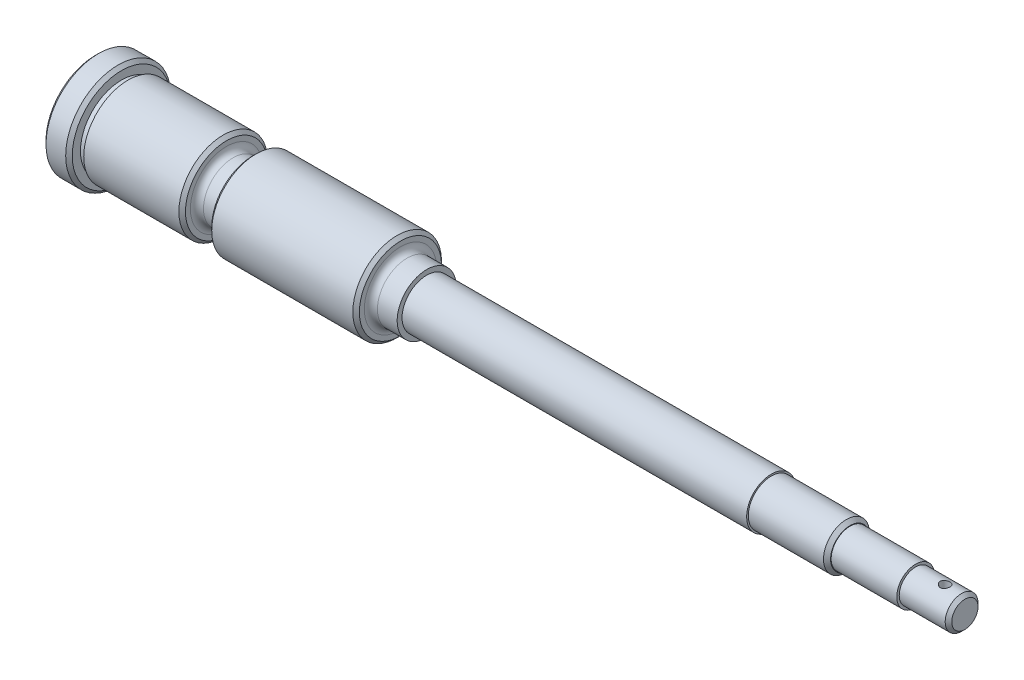
ISO-10303-21;
HEADER;
FILE_DESCRIPTION(('STEP AP214'),'2;1');
FILE_NAME('part.step','',(''),(''),'','','');
FILE_SCHEMA(('AUTOMOTIVE_DESIGN { 1 0 10303 214 1 1 1 1 }'));
ENDSEC;
DATA;
#1=APPLICATION_CONTEXT('core data for automotive mechanical design processes');
#2=APPLICATION_PROTOCOL_DEFINITION('international standard','automotive_design',2000,#1);
#3=PRODUCT_CONTEXT('',#1,'mechanical');
#4=PRODUCT('Part','Part','',(#3));
#5=PRODUCT_RELATED_PRODUCT_CATEGORY('part','',(#4));
#6=PRODUCT_DEFINITION_FORMATION('','',#4);
#7=PRODUCT_DEFINITION_CONTEXT('part definition',#1,'design');
#8=PRODUCT_DEFINITION('design','',#6,#7);
#9=PRODUCT_DEFINITION_SHAPE('','',#8);
#10=(LENGTH_UNIT() NAMED_UNIT(*) SI_UNIT(.MILLI.,.METRE.));
#11=(NAMED_UNIT(*) PLANE_ANGLE_UNIT() SI_UNIT($,.RADIAN.));
#12=(NAMED_UNIT(*) SI_UNIT($,.STERADIAN.) SOLID_ANGLE_UNIT());
#13=UNCERTAINTY_MEASURE_WITH_UNIT(LENGTH_MEASURE(1.E-05),#10,'distance_accuracy_value','');
#14=(GEOMETRIC_REPRESENTATION_CONTEXT(3) GLOBAL_UNCERTAINTY_ASSIGNED_CONTEXT((#13)) GLOBAL_UNIT_ASSIGNED_CONTEXT((#10,
#11,#12)) REPRESENTATION_CONTEXT('',''));
#15=CARTESIAN_POINT('',(0.,0.,0.));
#16=DIRECTION('',(0.,0.,1.));
#17=DIRECTION('',(1.,0.,0.));
#18=AXIS2_PLACEMENT_3D('',#15,#16,#17);
#19=CARTESIAN_POINT('',(0.,0.,0.));
#20=DIRECTION('',(1.,0.,0.));
#21=DIRECTION('',(0.,0.,-1.));
#22=AXIS2_PLACEMENT_3D('',#19,#20,#21);
#23=PLANE('',#22);
#24=CARTESIAN_POINT('',(0.,0.,0.));
#25=DIRECTION('',(1.,0.,0.));
#26=DIRECTION('',(0.,0.,-1.));
#27=AXIS2_PLACEMENT_3D('',#24,#25,#26);
#28=CIRCLE('',#27,15.);
#29=CARTESIAN_POINT('',(0.,0.,-15.));
#30=VERTEX_POINT('',#29);
#31=EDGE_CURVE('E97',#30,#30,#28,.F.);
#32=ORIENTED_EDGE('',*,*,#31,.T.);
#33=EDGE_LOOP('',(#32));
#34=FACE_BOUND('',#33,.T.);
#35=ADVANCED_FACE('F47',(#34),#23,.F.);
#36=CARTESIAN_POINT('',(0.,0.,0.));
#37=DIRECTION('',(-1.,0.,0.));
#38=DIRECTION('',(0.,0.,1.));
#39=AXIS2_PLACEMENT_3D('',#36,#37,#38);
#40=CYLINDRICAL_SURFACE('',#39,16.);
#41=CARTESIAN_POINT('',(7.00000000000007,0.,0.));
#42=DIRECTION('',(-1.,0.,0.));
#43=DIRECTION('',(0.,0.,1.));
#44=AXIS2_PLACEMENT_3D('',#41,#42,#43);
#45=CIRCLE('',#44,16.);
#46=CARTESIAN_POINT('',(7.00000000000007,0.,16.));
#47=VERTEX_POINT('',#46);
#48=EDGE_CURVE('E103',#47,#47,#45,.T.);
#49=ORIENTED_EDGE('',*,*,#48,.T.);
#50=EDGE_LOOP('',(#49));
#51=FACE_BOUND('',#50,.T.);
#52=CARTESIAN_POINT('',(0.999999999999959,0.,0.));
#53=DIRECTION('',(1.,0.,0.));
#54=DIRECTION('',(0.,0.,-1.));
#55=AXIS2_PLACEMENT_3D('',#52,#53,#54);
#56=CIRCLE('',#55,16.);
#57=CARTESIAN_POINT('',(0.999999999999959,0.,-16.));
#58=VERTEX_POINT('',#57);
#59=EDGE_CURVE('E106',#58,#58,#56,.T.);
#60=ORIENTED_EDGE('',*,*,#59,.T.);
#61=EDGE_LOOP('',(#60));
#62=FACE_BOUND('',#61,.T.);
#63=ADVANCED_FACE('F158',(#51,#62),#40,.T.);
#64=CARTESIAN_POINT('',(8.,16.,0.));
#65=DIRECTION('',(-1.,0.,0.));
#66=DIRECTION('',(0.,0.,1.));
#67=AXIS2_PLACEMENT_3D('',#64,#65,#66);
#68=PLANE('',#67);
#69=CARTESIAN_POINT('',(8.,0.,0.));
#70=DIRECTION('',(-1.,0.,0.));
#71=DIRECTION('',(0.,0.,1.));
#72=AXIS2_PLACEMENT_3D('',#69,#70,#71);
#73=CIRCLE('',#72,15.);
#74=CARTESIAN_POINT('',(8.,0.,15.));
#75=VERTEX_POINT('',#74);
#76=EDGE_CURVE('E100',#75,#75,#73,.F.);
#77=ORIENTED_EDGE('',*,*,#76,.T.);
#78=EDGE_LOOP('',(#77));
#79=FACE_BOUND('',#78,.T.);
#80=CARTESIAN_POINT('',(8.,0.,0.));
#81=DIRECTION('',(-1.,0.,0.));
#82=DIRECTION('',(0.,0.,1.));
#83=AXIS2_PLACEMENT_3D('',#80,#81,#82);
#84=CIRCLE('',#83,12.5);
#85=CARTESIAN_POINT('',(8.,0.,12.5));
#86=VERTEX_POINT('',#85);
#87=EDGE_CURVE('E109',#86,#86,#84,.T.);
#88=ORIENTED_EDGE('',*,*,#87,.T.);
#89=EDGE_LOOP('',(#88));
#90=FACE_BOUND('',#89,.T.);
#91=ADVANCED_FACE('F164',(#79,#90),#68,.F.);
#92=CARTESIAN_POINT('',(0.,0.,0.));
#93=DIRECTION('',(-1.,0.,0.));
#94=DIRECTION('',(0.,0.,1.));
#95=AXIS2_PLACEMENT_3D('',#92,#93,#94);
#96=CYLINDRICAL_SURFACE('',#95,12.5);
#97=ORIENTED_EDGE('',*,*,#87,.F.);
#98=EDGE_LOOP('',(#97));
#99=FACE_BOUND('',#98,.T.);
#100=CARTESIAN_POINT('',(10.,0.,0.));
#101=DIRECTION('',(-1.,0.,0.));
#102=DIRECTION('',(0.,0.,1.));
#103=AXIS2_PLACEMENT_3D('',#100,#101,#102);
#104=CIRCLE('',#103,12.5);
#105=CARTESIAN_POINT('',(10.,0.,12.5));
#106=VERTEX_POINT('',#105);
#107=EDGE_CURVE('E243',#106,#106,#104,.T.);
#108=ORIENTED_EDGE('',*,*,#107,.T.);
#109=EDGE_LOOP('',(#108));
#110=FACE_BOUND('',#109,.T.);
#111=ADVANCED_FACE('F256',(#99,#110),#96,.T.);
#112=CARTESIAN_POINT('',(10.,12.5,0.));
#113=DIRECTION('',(1.,0.,0.));
#114=DIRECTION('',(0.,0.,-1.));
#115=AXIS2_PLACEMENT_3D('',#112,#113,#114);
#116=PLANE('',#115);
#117=ORIENTED_EDGE('',*,*,#107,.F.);
#118=EDGE_LOOP('',(#117));
#119=FACE_BOUND('',#118,.T.);
#120=CARTESIAN_POINT('',(10.,0.,0.));
#121=DIRECTION('',(-1.,0.,0.));
#122=DIRECTION('',(0.,0.,1.));
#123=AXIS2_PLACEMENT_3D('',#120,#121,#122);
#124=CIRCLE('',#123,13.5);
#125=CARTESIAN_POINT('',(10.,0.,13.5));
#126=VERTEX_POINT('',#125);
#127=EDGE_CURVE('E241',#126,#126,#124,.T.);
#128=ORIENTED_EDGE('',*,*,#127,.T.);
#129=EDGE_LOOP('',(#128));
#130=FACE_BOUND('',#129,.T.);
#131=ADVANCED_FACE('F237',(#119,#130),#116,.F.);
#132=CARTESIAN_POINT('',(0.,0.,0.));
#133=DIRECTION('',(-1.,0.,0.));
#134=DIRECTION('',(0.,0.,1.));
#135=AXIS2_PLACEMENT_3D('',#132,#133,#134);
#136=CYLINDRICAL_SURFACE('',#135,13.5);
#137=CARTESIAN_POINT('',(39.,0.,0.));
#138=DIRECTION('',(-1.,0.,0.));
#139=DIRECTION('',(0.,0.,1.));
#140=AXIS2_PLACEMENT_3D('',#137,#138,#139);
#141=CIRCLE('',#140,13.5);
#142=CARTESIAN_POINT('',(39.,0.,13.5));
#143=VERTEX_POINT('',#142);
#144=EDGE_CURVE('E76',#143,#143,#141,.T.);
#145=ORIENTED_EDGE('',*,*,#144,.T.);
#146=EDGE_LOOP('',(#145));
#147=FACE_BOUND('',#146,.T.);
#148=ORIENTED_EDGE('',*,*,#127,.F.);
#149=EDGE_LOOP('',(#148));
#150=FACE_BOUND('',#149,.T.);
#151=ADVANCED_FACE('F229',(#147,#150),#136,.T.);
#152=CARTESIAN_POINT('',(40.,13.5,0.));
#153=DIRECTION('',(-1.,0.,0.));
#154=DIRECTION('',(0.,0.,1.));
#155=AXIS2_PLACEMENT_3D('',#152,#153,#154);
#156=PLANE('',#155);
#157=CARTESIAN_POINT('',(40.,0.,0.));
#158=DIRECTION('',(-1.,0.,0.));
#159=DIRECTION('',(0.,0.,1.));
#160=AXIS2_PLACEMENT_3D('',#157,#158,#159);
#161=CIRCLE('',#160,11.);
#162=CARTESIAN_POINT('',(40.,0.,11.));
#163=VERTEX_POINT('',#162);
#164=EDGE_CURVE('E58',#163,#163,#161,.T.);
#165=ORIENTED_EDGE('',*,*,#164,.T.);
#166=EDGE_LOOP('',(#165));
#167=FACE_BOUND('',#166,.T.);
#168=CARTESIAN_POINT('',(40.,0.,0.));
#169=DIRECTION('',(-1.,0.,0.));
#170=DIRECTION('',(0.,0.,1.));
#171=AXIS2_PLACEMENT_3D('',#168,#169,#170);
#172=CIRCLE('',#171,12.5);
#173=CARTESIAN_POINT('',(40.,0.,12.5));
#174=VERTEX_POINT('',#173);
#175=EDGE_CURVE('E73',#174,#174,#172,.F.);
#176=ORIENTED_EDGE('',*,*,#175,.T.);
#177=EDGE_LOOP('',(#176));
#178=FACE_BOUND('',#177,.T.);
#179=ADVANCED_FACE('F225',(#167,#178),#156,.F.);
#180=CARTESIAN_POINT('',(0.,0.,0.));
#181=DIRECTION('',(-1.,0.,0.));
#182=DIRECTION('',(0.,0.,1.));
#183=AXIS2_PLACEMENT_3D('',#180,#181,#182);
#184=CYLINDRICAL_SURFACE('',#183,9.);
#185=CARTESIAN_POINT('',(46.,0.,0.));
#186=DIRECTION('',(1.,0.,0.));
#187=DIRECTION('',(0.,0.,-1.));
#188=AXIS2_PLACEMENT_3D('',#185,#186,#187);
#189=CIRCLE('',#188,9.);
#190=CARTESIAN_POINT('',(46.,0.,-9.));
#191=VERTEX_POINT('',#190);
#192=EDGE_CURVE('E67',#191,#191,#189,.F.);
#193=ORIENTED_EDGE('',*,*,#192,.T.);
#194=EDGE_LOOP('',(#193));
#195=FACE_BOUND('',#194,.T.);
#196=CARTESIAN_POINT('',(42.,0.,0.));
#197=DIRECTION('',(-1.,0.,0.));
#198=DIRECTION('',(0.,0.,1.));
#199=AXIS2_PLACEMENT_3D('',#196,#197,#198);
#200=CIRCLE('',#199,9.);
#201=CARTESIAN_POINT('',(42.,0.,9.));
#202=VERTEX_POINT('',#201);
#203=EDGE_CURVE('E70',#202,#202,#200,.F.);
#204=ORIENTED_EDGE('',*,*,#203,.T.);
#205=EDGE_LOOP('',(#204));
#206=FACE_BOUND('',#205,.T.);
#207=ADVANCED_FACE('F228',(#195,#206),#184,.T.);
#208=CARTESIAN_POINT('',(48.,9.,0.));
#209=DIRECTION('',(1.,0.,0.));
#210=DIRECTION('',(0.,0.,-1.));
#211=AXIS2_PLACEMENT_3D('',#208,#209,#210);
#212=PLANE('',#211);
#213=CARTESIAN_POINT('',(48.,0.,0.));
#214=DIRECTION('',(1.,0.,0.));
#215=DIRECTION('',(0.,0.,-1.));
#216=AXIS2_PLACEMENT_3D('',#213,#214,#215);
#217=CIRCLE('',#216,11.);
#218=CARTESIAN_POINT('',(48.,0.,-11.));
#219=VERTEX_POINT('',#218);
#220=EDGE_CURVE('E62',#219,#219,#217,.T.);
#221=ORIENTED_EDGE('',*,*,#220,.T.);
#222=EDGE_LOOP('',(#221));
#223=FACE_BOUND('',#222,.T.);
#224=CARTESIAN_POINT('',(48.,0.,0.));
#225=DIRECTION('',(1.,0.,0.));
#226=DIRECTION('',(0.,0.,-1.));
#227=AXIS2_PLACEMENT_3D('',#224,#225,#226);
#228=CIRCLE('',#227,12.5);
#229=CARTESIAN_POINT('',(48.,0.,-12.5));
#230=VERTEX_POINT('',#229);
#231=EDGE_CURVE('E79',#230,#230,#228,.F.);
#232=ORIENTED_EDGE('',*,*,#231,.T.);
#233=EDGE_LOOP('',(#232));
#234=FACE_BOUND('',#233,.T.);
#235=ADVANCED_FACE('F294',(#223,#234),#212,.F.);
#236=CARTESIAN_POINT('',(0.,0.,0.));
#237=DIRECTION('',(-1.,0.,0.));
#238=DIRECTION('',(0.,0.,1.));
#239=AXIS2_PLACEMENT_3D('',#236,#237,#238);
#240=CYLINDRICAL_SURFACE('',#239,13.5);
#241=CARTESIAN_POINT('',(91.9999999999999,0.,0.));
#242=DIRECTION('',(-1.,0.,0.));
#243=DIRECTION('',(0.,0.,1.));
#244=AXIS2_PLACEMENT_3D('',#241,#242,#243);
#245=CIRCLE('',#244,13.5);
#246=CARTESIAN_POINT('',(91.9999999999999,0.,13.5));
#247=VERTEX_POINT('',#246);
#248=EDGE_CURVE('E85',#247,#247,#245,.T.);
#249=ORIENTED_EDGE('',*,*,#248,.T.);
#250=EDGE_LOOP('',(#249));
#251=FACE_BOUND('',#250,.T.);
#252=CARTESIAN_POINT('',(49.,0.,0.));
#253=DIRECTION('',(1.,0.,0.));
#254=DIRECTION('',(0.,0.,-1.));
#255=AXIS2_PLACEMENT_3D('',#252,#253,#254);
#256=CIRCLE('',#255,13.5);
#257=CARTESIAN_POINT('',(49.,0.,-13.5));
#258=VERTEX_POINT('',#257);
#259=EDGE_CURVE('E88',#258,#258,#256,.T.);
#260=ORIENTED_EDGE('',*,*,#259,.T.);
#261=EDGE_LOOP('',(#260));
#262=FACE_BOUND('',#261,.T.);
#263=ADVANCED_FACE('F290',(#251,#262),#240,.T.);
#264=CARTESIAN_POINT('',(93.,13.5,0.));
#265=DIRECTION('',(-1.,0.,0.));
#266=DIRECTION('',(0.,0.,1.));
#267=AXIS2_PLACEMENT_3D('',#264,#265,#266);
#268=PLANE('',#267);
#269=CARTESIAN_POINT('',(93.,0.,0.));
#270=DIRECTION('',(-1.,0.,0.));
#271=DIRECTION('',(0.,0.,1.));
#272=AXIS2_PLACEMENT_3D('',#269,#270,#271);
#273=CIRCLE('',#272,11.);
#274=CARTESIAN_POINT('',(93.,0.,11.));
#275=VERTEX_POINT('',#274);
#276=EDGE_CURVE('E54',#275,#275,#273,.T.);
#277=ORIENTED_EDGE('',*,*,#276,.T.);
#278=EDGE_LOOP('',(#277));
#279=FACE_BOUND('',#278,.T.);
#280=CARTESIAN_POINT('',(93.,0.,0.));
#281=DIRECTION('',(-1.,0.,0.));
#282=DIRECTION('',(0.,0.,1.));
#283=AXIS2_PLACEMENT_3D('',#280,#281,#282);
#284=CIRCLE('',#283,12.5);
#285=CARTESIAN_POINT('',(93.,0.,12.5));
#286=VERTEX_POINT('',#285);
#287=EDGE_CURVE('E82',#286,#286,#284,.F.);
#288=ORIENTED_EDGE('',*,*,#287,.T.);
#289=EDGE_LOOP('',(#288));
#290=FACE_BOUND('',#289,.T.);
#291=ADVANCED_FACE('F293',(#279,#290),#268,.F.);
#292=CARTESIAN_POINT('',(0.,0.,0.));
#293=DIRECTION('',(-1.,0.,0.));
#294=DIRECTION('',(0.,0.,1.));
#295=AXIS2_PLACEMENT_3D('',#292,#293,#294);
#296=CYLINDRICAL_SURFACE('',#295,9.);
#297=CARTESIAN_POINT('',(95.,0.,0.));
#298=DIRECTION('',(-1.,0.,0.));
#299=DIRECTION('',(0.,0.,1.));
#300=AXIS2_PLACEMENT_3D('',#297,#298,#299);
#301=CIRCLE('',#300,9.);
#302=CARTESIAN_POINT('',(95.,0.,9.));
#303=VERTEX_POINT('',#302);
#304=EDGE_CURVE('E10',#303,#303,#301,.F.);
#305=ORIENTED_EDGE('',*,*,#304,.T.);
#306=EDGE_LOOP('',(#305));
#307=FACE_BOUND('',#306,.T.);
#308=CARTESIAN_POINT('',(101.,0.,0.));
#309=DIRECTION('',(-1.,0.,0.));
#310=DIRECTION('',(0.,0.,1.));
#311=AXIS2_PLACEMENT_3D('',#308,#309,#310);
#312=CIRCLE('',#311,9.);
#313=CARTESIAN_POINT('',(101.,0.,9.));
#314=VERTEX_POINT('',#313);
#315=EDGE_CURVE('E244',#314,#314,#312,.T.);
#316=ORIENTED_EDGE('',*,*,#315,.T.);
#317=EDGE_LOOP('',(#316));
#318=FACE_BOUND('',#317,.T.);
#319=ADVANCED_FACE('F312',(#307,#318),#296,.T.);
#320=CARTESIAN_POINT('',(101.,9.,0.));
#321=DIRECTION('',(-1.,0.,0.));
#322=DIRECTION('',(0.,0.,1.));
#323=AXIS2_PLACEMENT_3D('',#320,#321,#322);
#324=PLANE('',#323);
#325=ORIENTED_EDGE('',*,*,#315,.F.);
#326=EDGE_LOOP('',(#325));
#327=FACE_BOUND('',#326,.T.);
#328=CARTESIAN_POINT('',(101.,0.,0.));
#329=DIRECTION('',(-1.,0.,0.));
#330=DIRECTION('',(0.,0.,1.));
#331=AXIS2_PLACEMENT_3D('',#328,#329,#330);
#332=CIRCLE('',#331,7.5);
#333=CARTESIAN_POINT('',(101.,0.,7.5));
#334=VERTEX_POINT('',#333);
#335=EDGE_CURVE('E249',#334,#334,#332,.T.);
#336=ORIENTED_EDGE('',*,*,#335,.T.);
#337=EDGE_LOOP('',(#336));
#338=FACE_BOUND('',#337,.T.);
#339=ADVANCED_FACE('F321',(#327,#338),#324,.F.);
#340=CARTESIAN_POINT('',(0.,0.,0.));
#341=DIRECTION('',(-1.,0.,0.));
#342=DIRECTION('',(0.,0.,1.));
#343=AXIS2_PLACEMENT_3D('',#340,#341,#342);
#344=CYLINDRICAL_SURFACE('',#343,7.5);
#345=CARTESIAN_POINT('',(206.,0.,0.));
#346=DIRECTION('',(-1.,0.,0.));
#347=DIRECTION('',(0.,0.,1.));
#348=AXIS2_PLACEMENT_3D('',#345,#346,#347);
#349=CIRCLE('',#348,7.5);
#350=CARTESIAN_POINT('',(206.,0.,7.5));
#351=VERTEX_POINT('',#350);
#352=EDGE_CURVE('E513',#351,#351,#349,.T.);
#353=ORIENTED_EDGE('',*,*,#352,.T.);
#354=EDGE_LOOP('',(#353));
#355=FACE_BOUND('',#354,.T.);
#356=ORIENTED_EDGE('',*,*,#335,.F.);
#357=EDGE_LOOP('',(#356));
#358=FACE_BOUND('',#357,.T.);
#359=ADVANCED_FACE('F147',(#355,#358),#344,.T.);
#360=CARTESIAN_POINT('',(230.,0.,0.));
#361=DIRECTION('',(-1.,0.,0.));
#362=DIRECTION('',(0.,0.,1.));
#363=AXIS2_PLACEMENT_3D('',#360,#361,#362);
#364=CYLINDRICAL_SURFACE('',#363,7.);
#365=CARTESIAN_POINT('',(206.,0.,0.));
#366=DIRECTION('',(-1.,0.,0.));
#367=DIRECTION('',(0.,0.,1.));
#368=AXIS2_PLACEMENT_3D('',#365,#366,#367);
#369=CIRCLE('',#368,7.);
#370=CARTESIAN_POINT('',(206.,0.,7.));
#371=VERTEX_POINT('',#370);
#372=EDGE_CURVE('E516',#371,#371,#369,.T.);
#373=ORIENTED_EDGE('',*,*,#372,.F.);
#374=EDGE_LOOP('',(#373));
#375=FACE_BOUND('',#374,.T.);
#376=CARTESIAN_POINT('',(228.9175,0.,0.));
#377=DIRECTION('',(-1.,0.,0.));
#378=DIRECTION('',(0.,0.,1.));
#379=AXIS2_PLACEMENT_3D('',#376,#377,#378);
#380=CIRCLE('',#379,7.);
#381=CARTESIAN_POINT('',(228.9175,0.,7.));
#382=VERTEX_POINT('',#381);
#383=EDGE_CURVE('E118',#382,#382,#380,.T.);
#384=ORIENTED_EDGE('',*,*,#383,.T.);
#385=EDGE_LOOP('',(#384));
#386=FACE_BOUND('',#385,.T.);
#387=ADVANCED_FACE('F144',(#375,#386),#364,.T.);
#388=CARTESIAN_POINT('',(206.,7.,0.));
#389=DIRECTION('',(-1.,0.,0.));
#390=DIRECTION('',(0.,0.,1.));
#391=AXIS2_PLACEMENT_3D('',#388,#389,#390);
#392=PLANE('',#391);
#393=ORIENTED_EDGE('',*,*,#352,.F.);
#394=EDGE_LOOP('',(#393));
#395=FACE_BOUND('',#394,.T.);
#396=ORIENTED_EDGE('',*,*,#372,.T.);
#397=EDGE_LOOP('',(#396));
#398=FACE_BOUND('',#397,.T.);
#399=ADVANCED_FACE('F140',(#395,#398),#392,.F.);
#400=CARTESIAN_POINT('',(230.,0.,0.));
#401=DIRECTION('',(-1.,0.,0.));
#402=DIRECTION('',(0.,0.,1.));
#403=AXIS2_PLACEMENT_3D('',#400,#401,#402);
#404=CONICAL_SURFACE('',#403,5.9175,0.785398163397454);
#405=ORIENTED_EDGE('',*,*,#383,.F.);
#406=EDGE_LOOP('',(#405));
#407=FACE_BOUND('',#406,.T.);
#408=CARTESIAN_POINT('',(230.,0.,0.));
#409=DIRECTION('',(-1.,0.,0.));
#410=DIRECTION('',(0.,0.,1.));
#411=AXIS2_PLACEMENT_3D('',#408,#409,#410);
#412=CIRCLE('',#411,5.9175);
#413=CARTESIAN_POINT('',(230.,0.,5.9175));
#414=VERTEX_POINT('',#413);
#415=EDGE_CURVE('E511',#414,#414,#412,.T.);
#416=ORIENTED_EDGE('',*,*,#415,.T.);
#417=EDGE_LOOP('',(#416));
#418=FACE_BOUND('',#417,.T.);
#419=ADVANCED_FACE('F135',(#407,#418),#404,.T.);
#420=CARTESIAN_POINT('',(265.,5.,0.));
#421=DIRECTION('',(-1.,0.,0.));
#422=DIRECTION('',(0.,0.,1.));
#423=AXIS2_PLACEMENT_3D('',#420,#421,#422);
#424=PLANE('',#423);
#425=CARTESIAN_POINT('',(265.,0.,0.));
#426=DIRECTION('',(-1.,0.,0.));
#427=DIRECTION('',(0.,0.,1.));
#428=AXIS2_PLACEMENT_3D('',#425,#426,#427);
#429=CIRCLE('',#428,3.99999999999995);
#430=CARTESIAN_POINT('',(265.,0.,3.99999999999995));
#431=VERTEX_POINT('',#430);
#432=EDGE_CURVE('E91',#431,#431,#429,.F.);
#433=ORIENTED_EDGE('',*,*,#432,.T.);
#434=EDGE_LOOP('',(#433));
#435=FACE_BOUND('',#434,.T.);
#436=ADVANCED_FACE('F139',(#435),#424,.F.);
#437=CARTESIAN_POINT('',(0.,0.,0.));
#438=DIRECTION('',(-1.,0.,0.));
#439=DIRECTION('',(0.,0.,1.));
#440=AXIS2_PLACEMENT_3D('',#437,#438,#439);
#441=CYLINDRICAL_SURFACE('',#440,5.);
#442=CARTESIAN_POINT('',(264.,0.,0.));
#443=DIRECTION('',(-1.,0.,0.));
#444=DIRECTION('',(0.,0.,1.));
#445=AXIS2_PLACEMENT_3D('',#442,#443,#444);
#446=CIRCLE('',#445,5.);
#447=CARTESIAN_POINT('',(264.,0.,5.));
#448=VERTEX_POINT('',#447);
#449=EDGE_CURVE('E94',#448,#448,#446,.T.);
#450=ORIENTED_EDGE('',*,*,#449,.T.);
#451=EDGE_LOOP('',(#450));
#452=FACE_BOUND('',#451,.T.);
#453=CARTESIAN_POINT('',(258.07346245339,-4.88655819307999,-1.05903211738024));
#454=CARTESIAN_POINT('',(258.01402627417,-4.89785612238693,-1.00689816723828));
#455=CARTESIAN_POINT('',(257.95899962885,-4.90936527601259,-0.949753136197921));
#456=CARTESIAN_POINT('',(257.859225055867,-4.93153986127524,-0.826925247331852));
#457=CARTESIAN_POINT('',(257.814481286981,-4.94220495040202,-0.761238951860133));
#458=CARTESIAN_POINT('',(257.736524255374,-4.96152929653142,-0.622974889145891));
#459=CARTESIAN_POINT('',(257.70332237713,-4.97018657031717,-0.550390407127135));
#460=CARTESIAN_POINT('',(257.649586728767,-4.98451024929464,-0.400404647230574));
#461=CARTESIAN_POINT('',(257.629049178232,-4.99017754694809,-0.323004814380675));
#462=CARTESIAN_POINT('',(257.601674559823,-4.99778693916467,-0.167473233067486));
#463=CARTESIAN_POINT('',(257.594534230998,-4.99981144765498,-0.0893989319615843));
#464=CARTESIAN_POINT('',(257.593286108102,-5.0001631475526,0.0668579541202975));
#465=CARTESIAN_POINT('',(257.599176948226,-4.998490726437,0.145040526889944));
#466=CARTESIAN_POINT('',(257.623500476303,-4.99171321592309,0.297483871248915));
#467=CARTESIAN_POINT('',(257.641652810267,-4.98668488804203,0.371793140446442));
#468=CARTESIAN_POINT('',(257.689614876676,-4.97380290596615,0.516285069480204));
#469=CARTESIAN_POINT('',(257.719425698315,-4.96594898779625,0.586467343047202));
#470=CARTESIAN_POINT('',(257.790445798276,-4.94806262314168,0.722110276110725));
#471=CARTESIAN_POINT('',(257.831848079635,-4.93799396889774,0.787464964435153));
#472=CARTESIAN_POINT('',(257.924676734797,-4.91680886013195,0.910434091587744));
#473=CARTESIAN_POINT('',(257.976105306483,-4.90569217614598,0.968046828601963));
#474=CARTESIAN_POINT('',(258.089491546016,-4.88321023997657,1.07582029491776));
#475=CARTESIAN_POINT('',(258.151734201936,-4.87184846327766,1.12568245527391));
#476=CARTESIAN_POINT('',(258.283916838286,-4.85052745270219,1.21427620887429));
#477=CARTESIAN_POINT('',(258.353856775672,-4.84056821098339,1.25300786435569));
#478=CARTESIAN_POINT('',(258.499387064214,-4.82325906978362,1.31807017040942));
#479=CARTESIAN_POINT('',(258.574962745115,-4.81590266352052,1.34443179924832));
#480=CARTESIAN_POINT('',(258.729731036276,-4.80469081067889,1.3839708891863));
#481=CARTESIAN_POINT('',(258.808922540665,-4.80083430111856,1.39715235346319));
#482=CARTESIAN_POINT('',(258.965519344682,-4.79719251619268,1.40960402155908));
#483=CARTESIAN_POINT('',(259.042881951494,-4.79726154224532,1.40937206679984));
#484=CARTESIAN_POINT('',(259.196425070474,-4.80109953166365,1.39624100806825));
#485=CARTESIAN_POINT('',(259.272605653257,-4.80486827313256,1.38334266378428));
#486=CARTESIAN_POINT('',(259.42055618264,-4.8155700139542,1.34560720907311));
#487=CARTESIAN_POINT('',(259.492372992528,-4.82245790926078,1.32094001682503));
#488=CARTESIAN_POINT('',(259.630889789774,-4.83860261397202,1.26051491587002));
#489=CARTESIAN_POINT('',(259.697588895981,-4.84785983013481,1.22475510259052));
#490=CARTESIAN_POINT('',(259.826220079765,-4.86805885701561,1.14187233030755));
#491=CARTESIAN_POINT('',(259.887940861532,-4.87904392155558,1.09443207520212));
#492=CARTESIAN_POINT('',(260.002716927718,-4.9012863594995,0.99006776701699));
#493=CARTESIAN_POINT('',(260.055770535397,-4.91254378511159,0.93314188315292));
#494=CARTESIAN_POINT('',(260.153243092103,-4.93445122729333,0.809468792299876));
#495=CARTESIAN_POINT('',(260.197370939964,-4.94507458294243,0.742486834615249));
#496=CARTESIAN_POINT('',(260.273727718803,-4.96416246823529,0.601768002300245));
#497=CARTESIAN_POINT('',(260.305957977882,-4.9726272388044,0.528031882769367));
#498=CARTESIAN_POINT('',(260.357084683803,-4.98633383211437,0.377007227214827));
#499=CARTESIAN_POINT('',(260.376171502275,-4.99162152219093,0.299787460241395));
#500=CARTESIAN_POINT('',(260.40109527262,-4.99856688042525,0.143084624741715));
#501=CARTESIAN_POINT('',(260.406935233886,-5.0002253730533,0.0636020744250844));
#502=CARTESIAN_POINT('',(260.405186300404,-4.99973282738711,-0.0926238798785592));
#503=CARTESIAN_POINT('',(260.398025024305,-4.99770309512778,-0.169372842397998));
#504=CARTESIAN_POINT('',(260.371353759496,-4.99028989007414,-0.320521154274614));
#505=CARTESIAN_POINT('',(260.351843752331,-4.98490641226784,-0.394920500120246));
#506=CARTESIAN_POINT('',(260.301126558157,-4.97135933427636,-0.539302375163756));
#507=CARTESIAN_POINT('',(260.269924083612,-4.9631968542452,-0.609286670519373));
#508=CARTESIAN_POINT('',(260.196745246437,-4.94493380789521,-0.743098919848729));
#509=CARTESIAN_POINT('',(260.154766865345,-4.93483287857035,-0.806925717361793));
#510=CARTESIAN_POINT('',(260.059653833202,-4.91337960318928,-0.928791696949649));
#511=CARTESIAN_POINT('',(260.006206184652,-4.90199762791216,-0.986581500840091));
#512=CARTESIAN_POINT('',(259.890402959225,-4.87948778757588,-1.09249114558696));
#513=CARTESIAN_POINT('',(259.82804602033,-4.86835996167234,-1.14060950519832));
#514=CARTESIAN_POINT('',(259.694834869251,-4.84741299861885,-1.22661600089452));
#515=CARTESIAN_POINT('',(259.623851108242,-4.83762015618782,-1.26431047868331));
#516=CARTESIAN_POINT('',(259.476224749315,-4.8207650936602,-1.32713590786886));
#517=CARTESIAN_POINT('',(259.399583509299,-4.81370222084088,-1.35226986284834));
#518=CARTESIAN_POINT('',(259.244995397752,-4.80334878430379,-1.38859314673187));
#519=CARTESIAN_POINT('',(259.167138824275,-4.79996203247191,-1.40013874470825));
#520=CARTESIAN_POINT('',(259.010521225152,-4.79705646726877,-1.41006337445405));
#521=CARTESIAN_POINT('',(258.931760332841,-4.79753709081135,-1.40844432298348));
#522=CARTESIAN_POINT('',(258.77819428193,-4.80222632998215,-1.39236674900737));
#523=CARTESIAN_POINT('',(258.703342555751,-4.80631746074817,-1.37831281704686));
#524=CARTESIAN_POINT('',(258.557118875588,-4.81758242596728,-1.33840413442754));
#525=CARTESIAN_POINT('',(258.485746196265,-4.82475561476167,-1.31255185532772));
#526=CARTESIAN_POINT('',(258.354616725338,-4.84061068044672,-1.25273655163004));
#527=CARTESIAN_POINT('',(258.294394708333,-4.84909430396991,-1.21973279688792));
#528=CARTESIAN_POINT('',(258.179503944726,-4.86718530345992,-1.1454121437833));
#529=CARTESIAN_POINT('',(258.124836021618,-4.8767928456148,-1.10409401536503));
#530=CARTESIAN_POINT('',(258.07346245339,-4.88655819307999,-1.05903211738024));
#531=B_SPLINE_CURVE_WITH_KNOTS('',3,(#453,#454,#455,#456,#457,#458,#459,#460,#461,#462,#463,
#464,#465,#466,#467,#468,#469,#470,#471,#472,#473,#474,#475,#476,#477,#478,#479,#480,#481,#482,
#483,#484,#485,#486,#487,#488,#489,#490,#491,#492,#493,#494,#495,#496,#497,#498,#499,#500,#501,
#502,#503,#504,#505,#506,#507,#508,#509,#510,#511,#512,#513,#514,#515,#516,#517,#518,#519,#520,
#521,#522,#523,#524,#525,#526,#527,#528,#529,#530),.UNSPECIFIED.,.T.,.F.,(4,2,2,2,2,2,2,2,2,2,2,
2,2,2,2,2,2,2,2,2,2,2,2,2,2,2,2,2,2,2,2,2,2,2,2,2,2,2,4),(0.,0.239349473006697,
0.478795578117295,0.718477197957143,0.958087235999388,1.19220475832635,1.42629774383963,
1.65521175214475,1.88414715183676,2.11714776455334,2.3501995113184,2.59073210958589,
2.83126336286888,3.07118899575098,3.31104173447645,3.5419982221584,3.7729408586758,
4.00064565363077,4.22838956653426,4.46317869777603,4.69801319735647,4.93957913673775,
5.18111810249709,5.41908051750491,5.65698886730372,5.88721351798354,6.11743851272215,
6.34757081853417,6.57774626247604,6.81525969102954,7.05280946864818,7.29451423664718,
7.53616117838578,7.77132036987458,8.00644532302954,8.23419035351631,8.46188769706183,
8.66873841371044,8.87561975506235),.UNSPECIFIED.);
#532=CARTESIAN_POINT('',(258.07346245339,-4.88655819307999,-1.05903211738024));
#533=VERTEX_POINT('',#532);
#534=EDGE_CURVE('E110',#533,#533,#531,.T.);
#535=ORIENTED_EDGE('',*,*,#534,.T.);
#536=EDGE_LOOP('',(#535));
#537=FACE_BOUND('',#536,.T.);
#538=CARTESIAN_POINT('',(258.010309753606,4.87346322366071,-1.11774603896709));
#539=CARTESIAN_POINT('',(258.072510386485,4.86086635257667,-1.17267152692177));
#540=CARTESIAN_POINT('',(258.139327514354,4.84847498852569,-1.22243369937824));
#541=CARTESIAN_POINT('',(258.280531023078,4.8254748607513,-1.31029098325288));
#542=CARTESIAN_POINT('',(258.35491809561,4.81486626015704,-1.34838502725814));
#543=CARTESIAN_POINT('',(258.509457964128,4.79665685392054,-1.41180037479732));
#544=CARTESIAN_POINT('',(258.589619868165,4.78906092826668,-1.43710097333832));
#545=CARTESIAN_POINT('',(258.753307322371,4.77785186143154,-1.4739434620389));
#546=CARTESIAN_POINT('',(258.836831876431,4.77423754965495,-1.48548939615402));
#547=CARTESIAN_POINT('',(259.002192772108,4.77149938313047,-1.49426000602135));
#548=CARTESIAN_POINT('',(259.084004993605,4.7722445908104,-1.49190225951377));
#549=CARTESIAN_POINT('',(259.246011071818,4.77782712975392,-1.47392480365938));
#550=CARTESIAN_POINT('',(259.326204940497,4.78266443075522,-1.45830519238814));
#551=CARTESIAN_POINT('',(259.481848887899,4.79577080212186,-1.41459903556487));
#552=CARTESIAN_POINT('',(259.557341392089,4.80400160033645,-1.38665128951629));
#553=CARTESIAN_POINT('',(259.702625583731,4.82296268229866,-1.31918660336507));
#554=CARTESIAN_POINT('',(259.772416161472,4.83369345103337,-1.27966741805394));
#555=CARTESIAN_POINT('',(259.907013142809,4.85692369984171,-1.18851845910392));
#556=CARTESIAN_POINT('',(259.971551804653,4.86947273295609,-1.13650590418481));
#557=CARTESIAN_POINT('',(260.09115744866,4.89467052949646,-1.02254628338539));
#558=CARTESIAN_POINT('',(260.146222592491,4.9073193117818,-0.960597293841636));
#559=CARTESIAN_POINT('',(260.246787591833,4.93169937084512,-0.826499287328787));
#560=CARTESIAN_POINT('',(260.291990876684,4.94339688807472,-0.754121035363611));
#561=CARTESIAN_POINT('',(260.369514832184,4.96416617348072,-0.60241653735079));
#562=CARTESIAN_POINT('',(260.401837720291,4.97323839354817,-0.523091490117134));
#563=CARTESIAN_POINT('',(260.451918077493,4.98755070345871,-0.36160288048422));
#564=CARTESIAN_POINT('',(260.469986892238,4.99287242007312,-0.279543336716619));
#565=CARTESIAN_POINT('',(260.49208181553,4.99940431635255,-0.113401477243385));
#566=CARTESIAN_POINT('',(260.49611144624,5.00061552726277,-0.0293196742147409));
#567=CARTESIAN_POINT('',(260.490094501807,4.9988240942254,0.135225347305718));
#568=CARTESIAN_POINT('',(260.480552833119,4.99597259270407,0.215709261671931));
#569=CARTESIAN_POINT('',(260.448636538344,4.98663236863681,0.373865319254028));
#570=CARTESIAN_POINT('',(260.426261657374,4.98014357384983,0.451537406591011));
#571=CARTESIAN_POINT('',(260.369328294623,4.9641807129406,0.602224699513935));
#572=CARTESIAN_POINT('',(260.334730917472,4.95469712690908,0.675224149075969));
#573=CARTESIAN_POINT('',(260.254390741765,4.9337178018258,0.81449065616832));
#574=CARTESIAN_POINT('',(260.208645537895,4.92222162867851,0.880756256389344));
#575=CARTESIAN_POINT('',(260.105283503862,4.8979132448897,1.00735314566925));
#576=CARTESIAN_POINT('',(260.047282874239,4.88506769222275,1.06736489525768));
#577=CARTESIAN_POINT('',(259.922048393967,4.85982842142046,1.17696122569307));
#578=CARTESIAN_POINT('',(259.854812994181,4.84743477953577,1.22654405354248));
#579=CARTESIAN_POINT('',(259.711412374648,4.82425781162614,1.31478698709282));
#580=CARTESIAN_POINT('',(259.63510002,4.81351012645683,1.35321815163345));
#581=CARTESIAN_POINT('',(259.476714444443,4.79523651029804,1.41661723716371));
#582=CARTESIAN_POINT('',(259.394642763364,4.78770972195121,1.44158874138528));
#583=CARTESIAN_POINT('',(259.229680490358,4.777015232288,1.47663617312846));
#584=CARTESIAN_POINT('',(259.14688816302,4.77372364631441,1.48713610326884));
#585=CARTESIAN_POINT('',(258.980659975313,4.77150980272799,1.49422573358512));
#586=CARTESIAN_POINT('',(258.897224248615,4.77258666070875,1.49081824936373));
#587=CARTESIAN_POINT('',(258.734915904912,4.77886356157623,1.47056642406118));
#588=CARTESIAN_POINT('',(258.655982903815,4.78392952289503,1.45415892930817));
#589=CARTESIAN_POINT('',(258.5020330822,4.79741981987158,1.40901147831328));
#590=CARTESIAN_POINT('',(258.427016720173,4.80584454772235,1.38027008184904));
#591=CARTESIAN_POINT('',(258.281511369286,4.82528227530523,1.31071418076616));
#592=CARTESIAN_POINT('',(258.211126865848,4.83633871830292,1.26969368173301));
#593=CARTESIAN_POINT('',(258.078072076568,4.8597500237018,1.17690867779641));
#594=CARTESIAN_POINT('',(258.015403642846,4.87210519652828,1.1251416013262));
#595=CARTESIAN_POINT('',(257.896978239429,4.89731602824626,1.00990256287986));
#596=CARTESIAN_POINT('',(257.841591766895,4.91017219056281,0.946049209939278));
#597=CARTESIAN_POINT('',(257.742270220356,4.93448218716065,0.809735567176796));
#598=CARTESIAN_POINT('',(257.698335354386,4.94593599596416,0.737275121029492));
#599=CARTESIAN_POINT('',(257.623226983786,4.9661769227473,0.585607141568961));
#600=CARTESIAN_POINT('',(257.59206012729,4.97496265087822,0.506396119183461));
#601=CARTESIAN_POINT('',(257.543610667507,4.98885289721405,0.343533131673882));
#602=CARTESIAN_POINT('',(257.526323972891,4.99395850013078,0.259882482934607));
#603=CARTESIAN_POINT('',(257.506662608087,4.99978128558508,0.0939185315472944));
#604=CARTESIAN_POINT('',(257.503748077701,5.00065731585283,0.0116745255855694));
#605=CARTESIAN_POINT('',(257.511475899144,4.99835650160925,-0.152111979787105));
#606=CARTESIAN_POINT('',(257.522117147463,4.99517998699584,-0.233654535755693));
#607=CARTESIAN_POINT('',(257.556239306137,4.98521920694757,-0.392152068397164));
#608=CARTESIAN_POINT('',(257.579475651019,4.97850372631525,-0.469164404204197));
#609=CARTESIAN_POINT('',(257.637863960439,4.96220304827993,-0.618194240794093));
#610=CARTESIAN_POINT('',(257.673016071039,4.95261781569995,-0.690211680336974));
#611=CARTESIAN_POINT('',(257.753364162067,4.93176019593006,-0.826057797788941));
#612=CARTESIAN_POINT('',(257.798335242208,4.92052718985289,-0.890025995744676));
#613=CARTESIAN_POINT('',(257.897617544033,4.89729027017773,-1.01009513804728));
#614=CARTESIAN_POINT('',(257.95193029532,4.88528623053275,-1.06619479126384));
#615=CARTESIAN_POINT('',(258.010309753606,4.87346322366071,-1.11774603896709));
#616=B_SPLINE_CURVE_WITH_KNOTS('',3,(#538,#539,#540,#541,#542,#543,#544,#545,#546,#547,#548,
#549,#550,#551,#552,#553,#554,#555,#556,#557,#558,#559,#560,#561,#562,#563,#564,#565,#566,#567,
#568,#569,#570,#571,#572,#573,#574,#575,#576,#577,#578,#579,#580,#581,#582,#583,#584,#585,#586,
#587,#588,#589,#590,#591,#592,#593,#594,#595,#596,#597,#598,#599,#600,#601,#602,#603,#604,#605,
#606,#607,#608,#609,#610,#611,#612,#613,#614,#615),.UNSPECIFIED.,.T.,.F.,(4,2,2,2,2,2,2,2,2,2,2,
2,2,2,2,2,2,2,2,2,2,2,2,2,2,2,2,2,2,2,2,2,2,2,2,2,2,2,4),(0.,0.251523811734581,
0.503070626269911,0.75502325312654,1.00690178607291,1.25125479976904,1.4956060064152,
1.73727367489,1.97898826529506,2.22935289384084,2.47976605084788,2.73690370030558,
2.99399706242961,3.24530607524858,3.49655203490479,3.73869143710348,3.98083564865355,
4.22375747623646,4.46673176440239,4.71890245637592,4.97111550190888,5.22818964732181,
5.48519532058856,5.7344983110822,5.98375083185269,6.22496562139283,6.46620858510795,
6.7117500295809,6.95735029795052,7.21264589427298,7.46794612808334,7.72337912491277,
7.97873680239924,8.22442533636978,8.47009387131107,8.71115462282916,8.95221832935307,
9.18825158124418,9.42432351805963),.UNSPECIFIED.);
#617=CARTESIAN_POINT('',(258.010309753606,4.87346322366071,-1.11774603896709));
#618=VERTEX_POINT('',#617);
#619=EDGE_CURVE('E119',#618,#618,#616,.T.);
#620=ORIENTED_EDGE('',*,*,#619,.T.);
#621=EDGE_LOOP('',(#620));
#622=FACE_BOUND('',#621,.T.);
#623=CARTESIAN_POINT('',(250.,0.,0.));
#624=DIRECTION('',(-1.,0.,0.));
#625=DIRECTION('',(0.,0.,1.));
#626=AXIS2_PLACEMENT_3D('',#623,#624,#625);
#627=CIRCLE('',#626,5.);
#628=CARTESIAN_POINT('',(250.,0.,5.));
#629=VERTEX_POINT('',#628);
#630=EDGE_CURVE('E523',#629,#629,#627,.T.);
#631=ORIENTED_EDGE('',*,*,#630,.F.);
#632=EDGE_LOOP('',(#631));
#633=FACE_BOUND('',#632,.T.);
#634=ADVANCED_FACE('F124',(#452,#537,#622,#633),#441,.T.);
#635=CARTESIAN_POINT('',(250.,5.75,0.));
#636=DIRECTION('',(-1.,0.,0.));
#637=DIRECTION('',(0.,0.,1.));
#638=AXIS2_PLACEMENT_3D('',#635,#636,#637);
#639=PLANE('',#638);
#640=CARTESIAN_POINT('',(250.,0.,0.));
#641=DIRECTION('',(-1.,0.,0.));
#642=DIRECTION('',(0.,0.,1.));
#643=AXIS2_PLACEMENT_3D('',#640,#641,#642);
#644=CIRCLE('',#643,5.75);
#645=CARTESIAN_POINT('',(250.,0.,5.75));
#646=VERTEX_POINT('',#645);
#647=EDGE_CURVE('E526',#646,#646,#644,.T.);
#648=ORIENTED_EDGE('',*,*,#647,.F.);
#649=EDGE_LOOP('',(#648));
#650=FACE_BOUND('',#649,.T.);
#651=ORIENTED_EDGE('',*,*,#630,.T.);
#652=EDGE_LOOP('',(#651));
#653=FACE_BOUND('',#652,.T.);
#654=ADVANCED_FACE('F155',(#650,#653),#639,.F.);
#655=CARTESIAN_POINT('',(0.,0.,0.));
#656=DIRECTION('',(-1.,0.,0.));
#657=DIRECTION('',(0.,0.,1.));
#658=AXIS2_PLACEMENT_3D('',#655,#656,#657);
#659=CYLINDRICAL_SURFACE('',#658,5.75);
#660=CARTESIAN_POINT('',(230.,0.,0.));
#661=DIRECTION('',(-1.,0.,0.));
#662=DIRECTION('',(0.,0.,1.));
#663=AXIS2_PLACEMENT_3D('',#660,#661,#662);
#664=CIRCLE('',#663,5.75);
#665=CARTESIAN_POINT('',(230.,0.,5.75));
#666=VERTEX_POINT('',#665);
#667=EDGE_CURVE('E508',#666,#666,#664,.T.);
#668=ORIENTED_EDGE('',*,*,#667,.F.);
#669=EDGE_LOOP('',(#668));
#670=FACE_BOUND('',#669,.T.);
#671=ORIENTED_EDGE('',*,*,#647,.T.);
#672=EDGE_LOOP('',(#671));
#673=FACE_BOUND('',#672,.T.);
#674=ADVANCED_FACE('F346',(#670,#673),#659,.T.);
#675=CARTESIAN_POINT('',(230.,7.5,0.));
#676=DIRECTION('',(-1.,0.,0.));
#677=DIRECTION('',(0.,0.,1.));
#678=AXIS2_PLACEMENT_3D('',#675,#676,#677);
#679=PLANE('',#678);
#680=ORIENTED_EDGE('',*,*,#667,.T.);
#681=EDGE_LOOP('',(#680));
#682=FACE_BOUND('',#681,.T.);
#683=ORIENTED_EDGE('',*,*,#415,.F.);
#684=EDGE_LOOP('',(#683));
#685=FACE_BOUND('',#684,.T.);
#686=ADVANCED_FACE('F133',(#682,#685),#679,.F.);
#687=CARTESIAN_POINT('',(259.,-5.69787202174833,0.));
#688=DIRECTION('',(0.,1.,0.));
#689=DIRECTION('',(0.,0.,1.));
#690=AXIS2_PLACEMENT_3D('',#687,#688,#689);
#691=CONICAL_SURFACE('',#690,1.40000000000001,0.00879062209316576);
#692=ORIENTED_EDGE('',*,*,#619,.F.);
#693=EDGE_LOOP('',(#692));
#694=FACE_BOUND('',#693,.T.);
#695=ORIENTED_EDGE('',*,*,#534,.F.);
#696=EDGE_LOOP('',(#695));
#697=FACE_BOUND('',#696,.T.);
#698=ADVANCED_FACE('F128',(#694,#697),#691,.F.);
#699=CARTESIAN_POINT('',(7.00000000000007,0.,0.));
#700=DIRECTION('',(-1.,0.,0.));
#701=DIRECTION('',(0.,0.,1.));
#702=AXIS2_PLACEMENT_3D('',#699,#700,#701);
#703=CONICAL_SURFACE('',#702,16.,0.785398163397462);
#704=ORIENTED_EDGE('',*,*,#76,.F.);
#705=EDGE_LOOP('',(#704));
#706=FACE_BOUND('',#705,.T.);
#707=ORIENTED_EDGE('',*,*,#48,.F.);
#708=EDGE_LOOP('',(#707));
#709=FACE_BOUND('',#708,.T.);
#710=ADVANCED_FACE('F132',(#706,#709),#703,.T.);
#711=CARTESIAN_POINT('',(0.,0.,0.));
#712=DIRECTION('',(1.,0.,0.));
#713=DIRECTION('',(0.,0.,-1.));
#714=AXIS2_PLACEMENT_3D('',#711,#712,#713);
#715=CONICAL_SURFACE('',#714,15.,0.785398163397448);
#716=ORIENTED_EDGE('',*,*,#59,.F.);
#717=EDGE_LOOP('',(#716));
#718=FACE_BOUND('',#717,.T.);
#719=ORIENTED_EDGE('',*,*,#31,.F.);
#720=EDGE_LOOP('',(#719));
#721=FACE_BOUND('',#720,.T.);
#722=ADVANCED_FACE('F175',(#718,#721),#715,.T.);
#723=CARTESIAN_POINT('',(264.,0.,0.));
#724=DIRECTION('',(-1.,0.,0.));
#725=DIRECTION('',(0.,0.,1.));
#726=AXIS2_PLACEMENT_3D('',#723,#724,#725);
#727=CONICAL_SURFACE('',#726,5.,0.785398163397447);
#728=ORIENTED_EDGE('',*,*,#432,.F.);
#729=EDGE_LOOP('',(#728));
#730=FACE_BOUND('',#729,.T.);
#731=ORIENTED_EDGE('',*,*,#449,.F.);
#732=EDGE_LOOP('',(#731));
#733=FACE_BOUND('',#732,.T.);
#734=ADVANCED_FACE('F182',(#730,#733),#727,.T.);
#735=CARTESIAN_POINT('',(91.9999999999999,0.,0.));
#736=DIRECTION('',(-1.,0.,0.));
#737=DIRECTION('',(0.,0.,1.));
#738=AXIS2_PLACEMENT_3D('',#735,#736,#737);
#739=CONICAL_SURFACE('',#738,13.5,0.785398163397436);
#740=ORIENTED_EDGE('',*,*,#287,.F.);
#741=EDGE_LOOP('',(#740));
#742=FACE_BOUND('',#741,.T.);
#743=ORIENTED_EDGE('',*,*,#248,.F.);
#744=EDGE_LOOP('',(#743));
#745=FACE_BOUND('',#744,.T.);
#746=ADVANCED_FACE('F189',(#742,#745),#739,.T.);
#747=CARTESIAN_POINT('',(48.,0.,0.));
#748=DIRECTION('',(1.,0.,0.));
#749=DIRECTION('',(0.,0.,-1.));
#750=AXIS2_PLACEMENT_3D('',#747,#748,#749);
#751=CONICAL_SURFACE('',#750,12.5,0.785398163397454);
#752=ORIENTED_EDGE('',*,*,#259,.F.);
#753=EDGE_LOOP('',(#752));
#754=FACE_BOUND('',#753,.T.);
#755=ORIENTED_EDGE('',*,*,#231,.F.);
#756=EDGE_LOOP('',(#755));
#757=FACE_BOUND('',#756,.T.);
#758=ADVANCED_FACE('F196',(#754,#757),#751,.T.);
#759=CARTESIAN_POINT('',(39.,0.,0.));
#760=DIRECTION('',(-1.,0.,0.));
#761=DIRECTION('',(0.,0.,1.));
#762=AXIS2_PLACEMENT_3D('',#759,#760,#761);
#763=CONICAL_SURFACE('',#762,13.5,0.785398163397464);
#764=ORIENTED_EDGE('',*,*,#175,.F.);
#765=EDGE_LOOP('',(#764));
#766=FACE_BOUND('',#765,.T.);
#767=ORIENTED_EDGE('',*,*,#144,.F.);
#768=EDGE_LOOP('',(#767));
#769=FACE_BOUND('',#768,.T.);
#770=ADVANCED_FACE('F203',(#766,#769),#763,.T.);
#771=CARTESIAN_POINT('',(46.,0.,0.));
#772=DIRECTION('',(1.,0.,0.));
#773=DIRECTION('',(0.,0.,-1.));
#774=AXIS2_PLACEMENT_3D('',#771,#772,#773);
#775=TOROIDAL_SURFACE('',#774,11.,2.);
#776=ORIENTED_EDGE('',*,*,#220,.F.);
#777=EDGE_LOOP('',(#776));
#778=FACE_BOUND('',#777,.T.);
#779=ORIENTED_EDGE('',*,*,#192,.F.);
#780=EDGE_LOOP('',(#779));
#781=FACE_BOUND('',#780,.T.);
#782=ADVANCED_FACE('F209',(#778,#781),#775,.F.);
#783=CARTESIAN_POINT('',(42.,0.,0.));
#784=DIRECTION('',(-1.,0.,0.));
#785=DIRECTION('',(0.,0.,1.));
#786=AXIS2_PLACEMENT_3D('',#783,#784,#785);
#787=TOROIDAL_SURFACE('',#786,11.,2.);
#788=ORIENTED_EDGE('',*,*,#203,.F.);
#789=EDGE_LOOP('',(#788));
#790=FACE_BOUND('',#789,.T.);
#791=ORIENTED_EDGE('',*,*,#164,.F.);
#792=EDGE_LOOP('',(#791));
#793=FACE_BOUND('',#792,.T.);
#794=ADVANCED_FACE('F212',(#790,#793),#787,.F.);
#795=CARTESIAN_POINT('',(95.,0.,0.));
#796=DIRECTION('',(-1.,0.,0.));
#797=DIRECTION('',(0.,0.,1.));
#798=AXIS2_PLACEMENT_3D('',#795,#796,#797);
#799=TOROIDAL_SURFACE('',#798,11.,2.);
#800=ORIENTED_EDGE('',*,*,#304,.F.);
#801=EDGE_LOOP('',(#800));
#802=FACE_BOUND('',#801,.T.);
#803=ORIENTED_EDGE('',*,*,#276,.F.);
#804=EDGE_LOOP('',(#803));
#805=FACE_BOUND('',#804,.T.);
#806=ADVANCED_FACE('F49',(#802,#805),#799,.F.);
#807=CLOSED_SHELL('',(#35,#63,#91,#111,#131,#151,#179,#207,#235,#263,#291,#319,#339,#359,#387,
#399,#419,#436,#634,#654,#674,#686,#698,#710,#722,#734,#746,#758,#770,#782,#794,#806));
#808=MANIFOLD_SOLID_BREP('B2',#807);
#809=ADVANCED_BREP_SHAPE_REPRESENTATION('',(#18,#808),#14);
#810=SHAPE_DEFINITION_REPRESENTATION(#9,#809);
ENDSEC;
END-ISO-10303-21;
